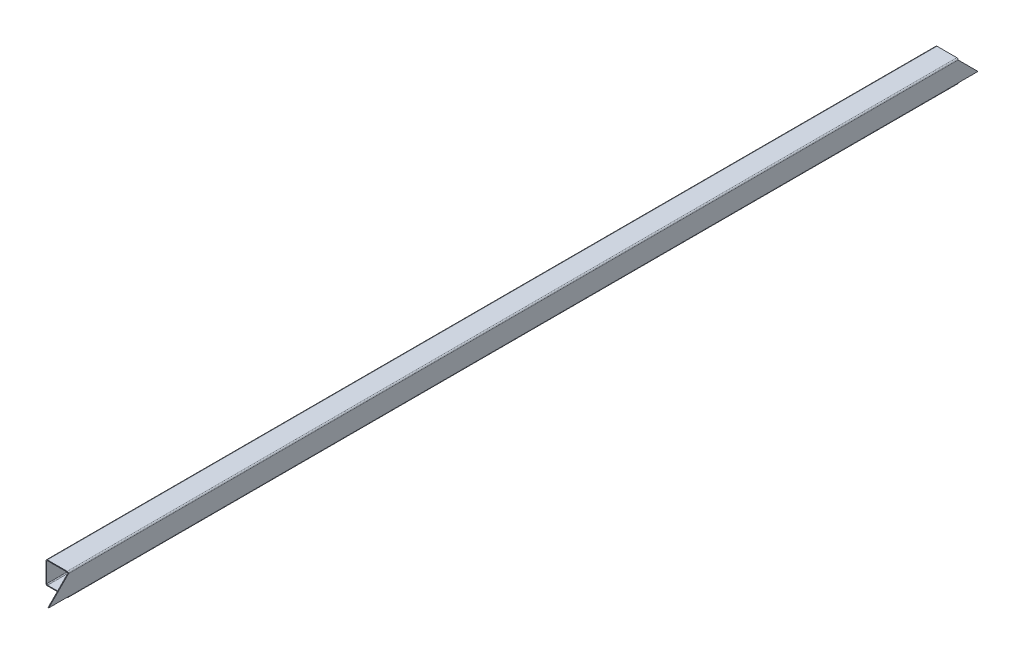
ISO-10303-21;
HEADER;
FILE_DESCRIPTION(('STEP AP214'),'2;1');
FILE_NAME('part.step','',(''),(''),'','','');
FILE_SCHEMA(('AUTOMOTIVE_DESIGN { 1 0 10303 214 1 1 1 1 }'));
ENDSEC;
DATA;
#1=APPLICATION_CONTEXT('core data for automotive mechanical design processes');
#2=APPLICATION_PROTOCOL_DEFINITION('international standard','automotive_design',2000,#1);
#3=PRODUCT_CONTEXT('',#1,'mechanical');
#4=PRODUCT('Part','Part','',(#3));
#5=PRODUCT_RELATED_PRODUCT_CATEGORY('part','',(#4));
#6=PRODUCT_DEFINITION_FORMATION('','',#4);
#7=PRODUCT_DEFINITION_CONTEXT('part definition',#1,'design');
#8=PRODUCT_DEFINITION('design','',#6,#7);
#9=PRODUCT_DEFINITION_SHAPE('','',#8);
#10=(LENGTH_UNIT() NAMED_UNIT(*) SI_UNIT(.MILLI.,.METRE.));
#11=(NAMED_UNIT(*) PLANE_ANGLE_UNIT() SI_UNIT($,.RADIAN.));
#12=(NAMED_UNIT(*) SI_UNIT($,.STERADIAN.) SOLID_ANGLE_UNIT());
#13=UNCERTAINTY_MEASURE_WITH_UNIT(LENGTH_MEASURE(1.E-05),#10,'distance_accuracy_value','');
#14=(GEOMETRIC_REPRESENTATION_CONTEXT(3) GLOBAL_UNCERTAINTY_ASSIGNED_CONTEXT((#13)) GLOBAL_UNIT_ASSIGNED_CONTEXT((#10,
#11,#12)) REPRESENTATION_CONTEXT('',''));
#15=CARTESIAN_POINT('',(0.,0.,0.));
#16=DIRECTION('',(0.,0.,1.));
#17=DIRECTION('',(1.,0.,0.));
#18=AXIS2_PLACEMENT_3D('',#15,#16,#17);
#19=CARTESIAN_POINT('',(-44.0000000000005,-43.9999999999965,-3950.));
#20=DIRECTION('',(0.,0.,1.));
#21=DIRECTION('',(1.,0.,0.));
#22=AXIS2_PLACEMENT_3D('',#19,#20,#21);
#23=PLANE('',#22);
#24=DIRECTION('',(0.,1.,0.));
#25=VECTOR('',#24,1.);
#26=CARTESIAN_POINT('',(46.9999999999991,-43.9999999999965,-3950.));
#27=LINE('',#26,#25);
#28=CARTESIAN_POINT('',(46.9999999999991,-43.9999999999965,-3950.));
#29=VERTEX_POINT('',#28);
#30=CARTESIAN_POINT('',(46.9999999999991,-42.9999999999966,-3950.));
#31=VERTEX_POINT('',#30);
#32=EDGE_CURVE('E46',#29,#31,#27,.T.);
#33=ORIENTED_EDGE('',*,*,#32,.F.);
#34=DIRECTION('',(1.,0.,0.));
#35=VECTOR('',#34,1.);
#36=CARTESIAN_POINT('',(-77.4507934888333,-43.9999999999965,-3950.));
#37=LINE('',#36,#35);
#38=CARTESIAN_POINT('',(49.9999999999989,-43.9999999999965,-3950.));
#39=VERTEX_POINT('',#38);
#40=EDGE_CURVE('E199',#29,#39,#37,.T.);
#41=ORIENTED_EDGE('',*,*,#40,.T.);
#42=CARTESIAN_POINT('',(43.9999999999987,-43.9999999999965,-3950.));
#43=DIRECTION('',(0.,0.,1.));
#44=DIRECTION('',(1.,0.,0.));
#45=AXIS2_PLACEMENT_3D('',#42,#43,#44);
#46=CIRCLE('',#45,6.00000000000014);
#47=CARTESIAN_POINT('',(43.9999999999987,-49.9999999999967,-3950.));
#48=VERTEX_POINT('',#47);
#49=EDGE_CURVE('E290',#48,#39,#46,.T.);
#50=ORIENTED_EDGE('',*,*,#49,.F.);
#51=DIRECTION('',(1.,0.,0.));
#52=VECTOR('',#51,1.);
#53=CARTESIAN_POINT('',(-44.0000000000005,-49.9999999999966,-3950.));
#54=LINE('',#53,#52);
#55=CARTESIAN_POINT('',(-44.0000000000005,-49.9999999999966,-3950.));
#56=VERTEX_POINT('',#55);
#57=EDGE_CURVE('E286',#56,#48,#54,.T.);
#58=ORIENTED_EDGE('',*,*,#57,.F.);
#59=CARTESIAN_POINT('',(-44.0000000000005,-43.9999999999965,-3950.));
#60=DIRECTION('',(0.,0.,1.));
#61=DIRECTION('',(1.,0.,0.));
#62=AXIS2_PLACEMENT_3D('',#59,#60,#61);
#63=CIRCLE('',#62,6.00000000000014);
#64=CARTESIAN_POINT('',(-50.0000000000007,-43.9999999999965,-3950.));
#65=VERTEX_POINT('',#64);
#66=EDGE_CURVE('E283',#65,#56,#63,.T.);
#67=ORIENTED_EDGE('',*,*,#66,.F.);
#68=DIRECTION('',(0.,-1.,0.));
#69=VECTOR('',#68,1.);
#70=CARTESIAN_POINT('',(-50.0000000000007,44.0000000000034,-3950.));
#71=LINE('',#70,#69);
#72=CARTESIAN_POINT('',(-50.0000000000007,44.0000000000034,-3950.));
#73=VERTEX_POINT('',#72);
#74=EDGE_CURVE('E301',#73,#65,#71,.T.);
#75=ORIENTED_EDGE('',*,*,#74,.F.);
#76=CARTESIAN_POINT('',(-44.0000000000005,44.0000000000034,-3950.));
#77=DIRECTION('',(0.,0.,1.));
#78=DIRECTION('',(1.,0.,0.));
#79=AXIS2_PLACEMENT_3D('',#76,#77,#78);
#80=CIRCLE('',#79,6.00000000000014);
#81=CARTESIAN_POINT('',(-44.0000000000005,50.0000000000036,-3950.));
#82=VERTEX_POINT('',#81);
#83=EDGE_CURVE('E298',#82,#73,#80,.T.);
#84=ORIENTED_EDGE('',*,*,#83,.F.);
#85=DIRECTION('',(-1.,0.,0.));
#86=VECTOR('',#85,1.);
#87=CARTESIAN_POINT('',(-44.0000000000005,50.0000000000035,-3950.));
#88=LINE('',#87,#86);
#89=CARTESIAN_POINT('',(43.9999999999987,50.0000000000035,-3950.));
#90=VERTEX_POINT('',#89);
#91=EDGE_CURVE('E295',#90,#82,#88,.T.);
#92=ORIENTED_EDGE('',*,*,#91,.F.);
#93=CARTESIAN_POINT('',(43.9999999999987,44.0000000000034,-3950.));
#94=DIRECTION('',(0.,0.,1.));
#95=DIRECTION('',(-1.,0.,0.));
#96=AXIS2_PLACEMENT_3D('',#93,#94,#95);
#97=CIRCLE('',#96,6.00000000000014);
#98=CARTESIAN_POINT('',(49.9999999999989,44.0000000000034,-3950.));
#99=VERTEX_POINT('',#98);
#100=EDGE_CURVE('E292',#99,#90,#97,.T.);
#101=ORIENTED_EDGE('',*,*,#100,.F.);
#102=DIRECTION('',(1.,0.,0.));
#103=VECTOR('',#102,1.);
#104=CARTESIAN_POINT('',(-77.4507934888333,44.0000000000034,-3950.));
#105=LINE('',#104,#103);
#106=CARTESIAN_POINT('',(46.9999999999991,44.0000000000034,-3950.));
#107=VERTEX_POINT('',#106);
#108=EDGE_CURVE('E59',#107,#99,#105,.T.);
#109=ORIENTED_EDGE('',*,*,#108,.F.);
#110=CARTESIAN_POINT('',(46.9999999999991,43.0000000000035,-3950.));
#111=VERTEX_POINT('',#110);
#112=EDGE_CURVE('E11',#111,#107,#27,.T.);
#113=ORIENTED_EDGE('',*,*,#112,.F.);
#114=CARTESIAN_POINT('',(42.9999999999991,43.0000000000035,-3950.));
#115=DIRECTION('',(0.,0.,1.));
#116=DIRECTION('',(-1.,0.,0.));
#117=AXIS2_PLACEMENT_3D('',#114,#115,#116);
#118=CIRCLE('',#117,4.);
#119=CARTESIAN_POINT('',(42.9999999999991,47.0000000000035,-3950.));
#120=VERTEX_POINT('',#119);
#121=EDGE_CURVE('E234',#111,#120,#118,.T.);
#122=ORIENTED_EDGE('',*,*,#121,.T.);
#123=DIRECTION('',(-1.,0.,0.));
#124=VECTOR('',#123,1.);
#125=CARTESIAN_POINT('',(-43.0000000000009,47.0000000000035,-3950.));
#126=LINE('',#125,#124);
#127=CARTESIAN_POINT('',(-43.0000000000009,47.0000000000035,-3950.));
#128=VERTEX_POINT('',#127);
#129=EDGE_CURVE('E237',#120,#128,#126,.T.);
#130=ORIENTED_EDGE('',*,*,#129,.T.);
#131=CARTESIAN_POINT('',(-43.0000000000009,43.0000000000035,-3950.));
#132=DIRECTION('',(0.,0.,1.));
#133=DIRECTION('',(1.,0.,0.));
#134=AXIS2_PLACEMENT_3D('',#131,#132,#133);
#135=CIRCLE('',#134,4.);
#136=CARTESIAN_POINT('',(-47.0000000000009,43.0000000000035,-3950.));
#137=VERTEX_POINT('',#136);
#138=EDGE_CURVE('E240',#128,#137,#135,.T.);
#139=ORIENTED_EDGE('',*,*,#138,.T.);
#140=DIRECTION('',(0.,-1.,0.));
#141=VECTOR('',#140,1.);
#142=CARTESIAN_POINT('',(-47.0000000000009,43.0000000000035,-3950.));
#143=LINE('',#142,#141);
#144=CARTESIAN_POINT('',(-47.0000000000009,-42.9999999999966,-3950.));
#145=VERTEX_POINT('',#144);
#146=EDGE_CURVE('E243',#137,#145,#143,.T.);
#147=ORIENTED_EDGE('',*,*,#146,.T.);
#148=CARTESIAN_POINT('',(-43.0000000000009,-42.9999999999966,-3950.));
#149=DIRECTION('',(0.,0.,1.));
#150=DIRECTION('',(1.,0.,0.));
#151=AXIS2_PLACEMENT_3D('',#148,#149,#150);
#152=CIRCLE('',#151,4.);
#153=CARTESIAN_POINT('',(-43.0000000000009,-46.9999999999966,-3950.));
#154=VERTEX_POINT('',#153);
#155=EDGE_CURVE('E225',#145,#154,#152,.T.);
#156=ORIENTED_EDGE('',*,*,#155,.T.);
#157=DIRECTION('',(1.,0.,0.));
#158=VECTOR('',#157,1.);
#159=CARTESIAN_POINT('',(-43.0000000000009,-46.9999999999966,-3950.));
#160=LINE('',#159,#158);
#161=CARTESIAN_POINT('',(42.9999999999991,-46.9999999999966,-3950.));
#162=VERTEX_POINT('',#161);
#163=EDGE_CURVE('E228',#154,#162,#160,.T.);
#164=ORIENTED_EDGE('',*,*,#163,.T.);
#165=CARTESIAN_POINT('',(42.9999999999991,-42.9999999999966,-3950.));
#166=DIRECTION('',(0.,0.,1.));
#167=DIRECTION('',(1.,0.,0.));
#168=AXIS2_PLACEMENT_3D('',#165,#166,#167);
#169=CIRCLE('',#168,4.);
#170=EDGE_CURVE('E232',#162,#31,#169,.T.);
#171=ORIENTED_EDGE('',*,*,#170,.T.);
#172=EDGE_LOOP('',(#33,#41,#50,#58,#67,#75,#84,#92,#101,#109,#113,#122,#130,#139,#147,#156,#164,#171));
#173=FACE_BOUND('',#172,.T.);
#174=ADVANCED_FACE('F35',(#173),#23,.F.);
#175=CARTESIAN_POINT('',(-44.0000000000005,-43.9999999999965,-3950.));
#176=DIRECTION('',(0.,0.,1.));
#177=DIRECTION('',(1.,0.,0.));
#178=AXIS2_PLACEMENT_3D('',#175,#176,#177);
#179=CYLINDRICAL_SURFACE('',#178,6.00000000000014);
#180=CARTESIAN_POINT('',(-44.0000000000005,-43.9999999999965,0.));
#181=DIRECTION('',(0.,0.,1.));
#182=DIRECTION('',(1.,0.,0.));
#183=AXIS2_PLACEMENT_3D('',#180,#181,#182);
#184=CIRCLE('',#183,6.00000000000014);
#185=CARTESIAN_POINT('',(-50.0000000000007,-43.9999999999965,0.));
#186=VERTEX_POINT('',#185);
#187=CARTESIAN_POINT('',(-44.0000000000005,-49.9999999999966,0.));
#188=VERTEX_POINT('',#187);
#189=EDGE_CURVE('E267',#186,#188,#184,.T.);
#190=ORIENTED_EDGE('',*,*,#189,.F.);
#191=DIRECTION('',(0.,0.,1.));
#192=VECTOR('',#191,1.);
#193=CARTESIAN_POINT('',(-50.0000000000007,-43.9999999999965,-3950.));
#194=LINE('',#193,#192);
#195=EDGE_CURVE('E322',#65,#186,#194,.T.);
#196=ORIENTED_EDGE('',*,*,#195,.F.);
#197=ORIENTED_EDGE('',*,*,#66,.T.);
#198=DIRECTION('',(0.,0.,1.));
#199=VECTOR('',#198,1.);
#200=CARTESIAN_POINT('',(-44.0000000000005,-49.9999999999966,-3950.));
#201=LINE('',#200,#199);
#202=EDGE_CURVE('E39',#56,#188,#201,.T.);
#203=ORIENTED_EDGE('',*,*,#202,.T.);
#204=EDGE_LOOP('',(#190,#196,#197,#203));
#205=FACE_BOUND('',#204,.T.);
#206=ADVANCED_FACE('F37',(#205),#179,.T.);
#207=CARTESIAN_POINT('',(-50.0000000000007,44.0000000000034,-3950.));
#208=DIRECTION('',(-1.,0.,0.));
#209=DIRECTION('',(0.,0.,1.));
#210=AXIS2_PLACEMENT_3D('',#207,#208,#209);
#211=PLANE('',#210);
#212=DIRECTION('',(0.,-1.,0.));
#213=VECTOR('',#212,1.);
#214=CARTESIAN_POINT('',(-50.0000000000007,44.0000000000034,0.));
#215=LINE('',#214,#213);
#216=CARTESIAN_POINT('',(-50.0000000000007,44.0000000000034,0.));
#217=VERTEX_POINT('',#216);
#218=EDGE_CURVE('E287',#217,#186,#215,.T.);
#219=ORIENTED_EDGE('',*,*,#218,.F.);
#220=DIRECTION('',(0.,0.,1.));
#221=VECTOR('',#220,1.);
#222=CARTESIAN_POINT('',(-50.0000000000007,44.0000000000034,-3950.));
#223=LINE('',#222,#221);
#224=EDGE_CURVE('E324',#73,#217,#223,.T.);
#225=ORIENTED_EDGE('',*,*,#224,.F.);
#226=ORIENTED_EDGE('',*,*,#74,.T.);
#227=ORIENTED_EDGE('',*,*,#195,.T.);
#228=EDGE_LOOP('',(#219,#225,#226,#227));
#229=FACE_BOUND('',#228,.T.);
#230=ADVANCED_FACE('F346',(#229),#211,.T.);
#231=CARTESIAN_POINT('',(-44.0000000000005,44.0000000000034,-3950.));
#232=DIRECTION('',(0.,0.,1.));
#233=DIRECTION('',(1.,0.,0.));
#234=AXIS2_PLACEMENT_3D('',#231,#232,#233);
#235=CYLINDRICAL_SURFACE('',#234,6.00000000000014);
#236=CARTESIAN_POINT('',(-44.0000000000005,44.0000000000034,0.));
#237=DIRECTION('',(0.,0.,1.));
#238=DIRECTION('',(1.,0.,0.));
#239=AXIS2_PLACEMENT_3D('',#236,#237,#238);
#240=CIRCLE('',#239,6.00000000000014);
#241=CARTESIAN_POINT('',(-44.0000000000005,50.0000000000036,0.));
#242=VERTEX_POINT('',#241);
#243=EDGE_CURVE('E317',#242,#217,#240,.T.);
#244=ORIENTED_EDGE('',*,*,#243,.F.);
#245=DIRECTION('',(0.,0.,1.));
#246=VECTOR('',#245,1.);
#247=CARTESIAN_POINT('',(-44.0000000000005,50.0000000000036,-3950.));
#248=LINE('',#247,#246);
#249=EDGE_CURVE('E326',#82,#242,#248,.T.);
#250=ORIENTED_EDGE('',*,*,#249,.F.);
#251=ORIENTED_EDGE('',*,*,#83,.T.);
#252=ORIENTED_EDGE('',*,*,#224,.T.);
#253=EDGE_LOOP('',(#244,#250,#251,#252));
#254=FACE_BOUND('',#253,.T.);
#255=ADVANCED_FACE('F413',(#254),#235,.T.);
#256=CARTESIAN_POINT('',(-44.0000000000005,50.0000000000035,-3950.));
#257=DIRECTION('',(0.,1.,0.));
#258=DIRECTION('',(0.,0.,1.));
#259=AXIS2_PLACEMENT_3D('',#256,#257,#258);
#260=PLANE('',#259);
#261=DIRECTION('',(-1.,0.,0.));
#262=VECTOR('',#261,1.);
#263=CARTESIAN_POINT('',(-44.0000000000005,50.0000000000035,0.));
#264=LINE('',#263,#262);
#265=CARTESIAN_POINT('',(43.9999999999987,50.0000000000035,0.));
#266=VERTEX_POINT('',#265);
#267=EDGE_CURVE('E314',#266,#242,#264,.T.);
#268=ORIENTED_EDGE('',*,*,#267,.F.);
#269=DIRECTION('',(0.,0.,1.));
#270=VECTOR('',#269,1.);
#271=CARTESIAN_POINT('',(43.9999999999987,50.0000000000035,-3950.));
#272=LINE('',#271,#270);
#273=EDGE_CURVE('E328',#90,#266,#272,.T.);
#274=ORIENTED_EDGE('',*,*,#273,.F.);
#275=ORIENTED_EDGE('',*,*,#91,.T.);
#276=ORIENTED_EDGE('',*,*,#249,.T.);
#277=EDGE_LOOP('',(#268,#274,#275,#276));
#278=FACE_BOUND('',#277,.T.);
#279=ADVANCED_FACE('F416',(#278),#260,.T.);
#280=CARTESIAN_POINT('',(43.9999999999987,44.0000000000034,-3950.));
#281=DIRECTION('',(0.,0.,1.));
#282=DIRECTION('',(1.,0.,0.));
#283=AXIS2_PLACEMENT_3D('',#280,#281,#282);
#284=CYLINDRICAL_SURFACE('',#283,6.00000000000014);
#285=CARTESIAN_POINT('',(43.9999999999987,44.0000000000034,0.));
#286=DIRECTION('',(0.,0.,1.));
#287=DIRECTION('',(-1.,0.,0.));
#288=AXIS2_PLACEMENT_3D('',#285,#286,#287);
#289=CIRCLE('',#288,6.00000000000014);
#290=CARTESIAN_POINT('',(49.9999999999988,44.0000000000034,0.));
#291=VERTEX_POINT('',#290);
#292=EDGE_CURVE('E311',#291,#266,#289,.T.);
#293=ORIENTED_EDGE('',*,*,#292,.F.);
#294=DIRECTION('',(0.,0.,1.));
#295=VECTOR('',#294,1.);
#296=CARTESIAN_POINT('',(49.9999999999988,44.0000000000034,-3950.));
#297=LINE('',#296,#295);
#298=EDGE_CURVE('E330',#99,#291,#297,.T.);
#299=ORIENTED_EDGE('',*,*,#298,.F.);
#300=ORIENTED_EDGE('',*,*,#100,.T.);
#301=ORIENTED_EDGE('',*,*,#273,.T.);
#302=EDGE_LOOP('',(#293,#299,#300,#301));
#303=FACE_BOUND('',#302,.T.);
#304=ADVANCED_FACE('F420',(#303),#284,.T.);
#305=CARTESIAN_POINT('',(49.9999999999989,44.0000000000034,-3950.));
#306=DIRECTION('',(1.,0.,0.));
#307=DIRECTION('',(0.,0.,-1.));
#308=AXIS2_PLACEMENT_3D('',#305,#306,#307);
#309=PLANE('',#308);
#310=ORIENTED_EDGE('',*,*,#298,.T.);
#311=DIRECTION('',(0.,-0.707106781186548,0.707106781186547));
#312=VECTOR('',#311,1.);
#313=CARTESIAN_POINT('',(49.9999999999989,-43.9999999999966,88.));
#314=LINE('',#313,#312);
#315=CARTESIAN_POINT('',(49.9999999999989,-43.9999999999966,88.));
#316=VERTEX_POINT('',#315);
#317=EDGE_CURVE('E213',#291,#316,#314,.T.);
#318=ORIENTED_EDGE('',*,*,#317,.T.);
#319=DIRECTION('',(0.,0.,-1.));
#320=VECTOR('',#319,1.);
#321=CARTESIAN_POINT('',(49.9999999999989,-43.9999999999965,0.));
#322=LINE('',#321,#320);
#323=CARTESIAN_POINT('',(49.9999999999989,-43.9999999999965,0.));
#324=VERTEX_POINT('',#323);
#325=EDGE_CURVE('E204',#316,#324,#322,.T.);
#326=ORIENTED_EDGE('',*,*,#325,.T.);
#327=DIRECTION('',(0.,0.,1.));
#328=VECTOR('',#327,1.);
#329=CARTESIAN_POINT('',(49.9999999999989,-43.9999999999965,-3950.));
#330=LINE('',#329,#328);
#331=EDGE_CURVE('E194',#39,#324,#330,.T.);
#332=ORIENTED_EDGE('',*,*,#331,.F.);
#333=DIRECTION('',(0.,0.,-1.));
#334=VECTOR('',#333,1.);
#335=CARTESIAN_POINT('',(49.9999999999989,-43.9999999999965,-3950.));
#336=LINE('',#335,#334);
#337=CARTESIAN_POINT('',(49.9999999999989,-43.9999999999965,-4038.));
#338=VERTEX_POINT('',#337);
#339=EDGE_CURVE('E179',#39,#338,#336,.T.);
#340=ORIENTED_EDGE('',*,*,#339,.T.);
#341=DIRECTION('',(0.,0.707106781186547,0.707106781186548));
#342=VECTOR('',#341,1.);
#343=CARTESIAN_POINT('',(49.9999999999989,-43.9999999999965,-4038.));
#344=LINE('',#343,#342);
#345=EDGE_CURVE('E183',#338,#99,#344,.T.);
#346=ORIENTED_EDGE('',*,*,#345,.T.);
#347=EDGE_LOOP('',(#310,#318,#326,#332,#340,#346));
#348=FACE_BOUND('',#347,.T.);
#349=ADVANCED_FACE('F191',(#348),#309,.T.);
#350=CARTESIAN_POINT('',(43.9999999999987,-43.9999999999965,-3950.));
#351=DIRECTION('',(0.,0.,1.));
#352=DIRECTION('',(1.,0.,0.));
#353=AXIS2_PLACEMENT_3D('',#350,#351,#352);
#354=CYLINDRICAL_SURFACE('',#353,6.00000000000014);
#355=CARTESIAN_POINT('',(43.9999999999987,-43.9999999999965,0.));
#356=DIRECTION('',(0.,0.,1.));
#357=DIRECTION('',(1.,0.,0.));
#358=AXIS2_PLACEMENT_3D('',#355,#356,#357);
#359=CIRCLE('',#358,6.00000000000014);
#360=CARTESIAN_POINT('',(43.9999999999987,-49.9999999999967,0.));
#361=VERTEX_POINT('',#360);
#362=EDGE_CURVE('E309',#361,#324,#359,.T.);
#363=ORIENTED_EDGE('',*,*,#362,.F.);
#364=DIRECTION('',(0.,0.,1.));
#365=VECTOR('',#364,1.);
#366=CARTESIAN_POINT('',(43.9999999999987,-49.9999999999967,-3950.));
#367=LINE('',#366,#365);
#368=EDGE_CURVE('E332',#48,#361,#367,.T.);
#369=ORIENTED_EDGE('',*,*,#368,.F.);
#370=ORIENTED_EDGE('',*,*,#49,.T.);
#371=ORIENTED_EDGE('',*,*,#331,.T.);
#372=EDGE_LOOP('',(#363,#369,#370,#371));
#373=FACE_BOUND('',#372,.T.);
#374=ADVANCED_FACE('F351',(#373),#354,.T.);
#375=CARTESIAN_POINT('',(-44.0000000000005,-49.9999999999966,-3950.));
#376=DIRECTION('',(0.,-1.,0.));
#377=DIRECTION('',(0.,0.,-1.));
#378=AXIS2_PLACEMENT_3D('',#375,#376,#377);
#379=PLANE('',#378);
#380=DIRECTION('',(1.,0.,0.));
#381=VECTOR('',#380,1.);
#382=CARTESIAN_POINT('',(-44.0000000000005,-49.9999999999966,0.));
#383=LINE('',#382,#381);
#384=EDGE_CURVE('E306',#188,#361,#383,.T.);
#385=ORIENTED_EDGE('',*,*,#384,.F.);
#386=ORIENTED_EDGE('',*,*,#202,.F.);
#387=ORIENTED_EDGE('',*,*,#57,.T.);
#388=ORIENTED_EDGE('',*,*,#368,.T.);
#389=EDGE_LOOP('',(#385,#386,#387,#388));
#390=FACE_BOUND('',#389,.T.);
#391=ADVANCED_FACE('F340',(#390),#379,.T.);
#392=CARTESIAN_POINT('',(-44.0000000000005,-43.9999999999965,0.));
#393=DIRECTION('',(0.,0.,1.));
#394=DIRECTION('',(1.,0.,0.));
#395=AXIS2_PLACEMENT_3D('',#392,#393,#394);
#396=PLANE('',#395);
#397=DIRECTION('',(0.,-1.,0.));
#398=VECTOR('',#397,1.);
#399=CARTESIAN_POINT('',(46.9999999999991,-43.9999999999965,0.));
#400=LINE('',#399,#398);
#401=CARTESIAN_POINT('',(46.9999999999991,44.0000000000034,0.));
#402=VERTEX_POINT('',#401);
#403=CARTESIAN_POINT('',(46.9999999999991,43.0000000000035,0.));
#404=VERTEX_POINT('',#403);
#405=EDGE_CURVE('E211',#402,#404,#400,.T.);
#406=ORIENTED_EDGE('',*,*,#405,.F.);
#407=DIRECTION('',(1.,0.,0.));
#408=VECTOR('',#407,1.);
#409=CARTESIAN_POINT('',(-77.4507934888333,44.0000000000034,0.));
#410=LINE('',#409,#408);
#411=EDGE_CURVE('E218',#402,#291,#410,.T.);
#412=ORIENTED_EDGE('',*,*,#411,.T.);
#413=ORIENTED_EDGE('',*,*,#292,.T.);
#414=ORIENTED_EDGE('',*,*,#267,.T.);
#415=ORIENTED_EDGE('',*,*,#243,.T.);
#416=ORIENTED_EDGE('',*,*,#218,.T.);
#417=ORIENTED_EDGE('',*,*,#189,.T.);
#418=ORIENTED_EDGE('',*,*,#384,.T.);
#419=ORIENTED_EDGE('',*,*,#362,.T.);
#420=DIRECTION('',(1.,0.,0.));
#421=VECTOR('',#420,1.);
#422=CARTESIAN_POINT('',(-77.4507934888333,-43.9999999999965,0.));
#423=LINE('',#422,#421);
#424=CARTESIAN_POINT('',(46.9999999999991,-43.9999999999965,0.));
#425=VERTEX_POINT('',#424);
#426=EDGE_CURVE('E216',#425,#324,#423,.T.);
#427=ORIENTED_EDGE('',*,*,#426,.F.);
#428=CARTESIAN_POINT('',(46.9999999999991,-42.9999999999966,0.));
#429=VERTEX_POINT('',#428);
#430=EDGE_CURVE('E44',#429,#425,#400,.T.);
#431=ORIENTED_EDGE('',*,*,#430,.F.);
#432=CARTESIAN_POINT('',(42.9999999999991,-42.9999999999966,0.));
#433=DIRECTION('',(0.,0.,1.));
#434=DIRECTION('',(1.,0.,0.));
#435=AXIS2_PLACEMENT_3D('',#432,#433,#434);
#436=CIRCLE('',#435,4.);
#437=CARTESIAN_POINT('',(42.9999999999991,-46.9999999999966,0.));
#438=VERTEX_POINT('',#437);
#439=EDGE_CURVE('E251',#438,#429,#436,.T.);
#440=ORIENTED_EDGE('',*,*,#439,.F.);
#441=DIRECTION('',(1.,0.,0.));
#442=VECTOR('',#441,1.);
#443=CARTESIAN_POINT('',(-43.0000000000009,-46.9999999999966,0.));
#444=LINE('',#443,#442);
#445=CARTESIAN_POINT('',(-43.0000000000009,-46.9999999999966,0.));
#446=VERTEX_POINT('',#445);
#447=EDGE_CURVE('E248',#446,#438,#444,.T.);
#448=ORIENTED_EDGE('',*,*,#447,.F.);
#449=CARTESIAN_POINT('',(-43.0000000000009,-42.9999999999966,0.));
#450=DIRECTION('',(0.,0.,1.));
#451=DIRECTION('',(1.,0.,0.));
#452=AXIS2_PLACEMENT_3D('',#449,#450,#451);
#453=CIRCLE('',#452,4.);
#454=CARTESIAN_POINT('',(-47.0000000000009,-42.9999999999966,0.));
#455=VERTEX_POINT('',#454);
#456=EDGE_CURVE('E224',#455,#446,#453,.T.);
#457=ORIENTED_EDGE('',*,*,#456,.F.);
#458=DIRECTION('',(0.,-1.,0.));
#459=VECTOR('',#458,1.);
#460=CARTESIAN_POINT('',(-47.0000000000009,43.0000000000035,0.));
#461=LINE('',#460,#459);
#462=CARTESIAN_POINT('',(-47.0000000000009,43.0000000000035,0.));
#463=VERTEX_POINT('',#462);
#464=EDGE_CURVE('E229',#463,#455,#461,.T.);
#465=ORIENTED_EDGE('',*,*,#464,.F.);
#466=CARTESIAN_POINT('',(-43.0000000000009,43.0000000000035,0.));
#467=DIRECTION('',(0.,0.,1.));
#468=DIRECTION('',(1.,0.,0.));
#469=AXIS2_PLACEMENT_3D('',#466,#467,#468);
#470=CIRCLE('',#469,4.);
#471=CARTESIAN_POINT('',(-43.0000000000009,47.0000000000035,0.));
#472=VERTEX_POINT('',#471);
#473=EDGE_CURVE('E260',#472,#463,#470,.T.);
#474=ORIENTED_EDGE('',*,*,#473,.F.);
#475=DIRECTION('',(-1.,0.,0.));
#476=VECTOR('',#475,1.);
#477=CARTESIAN_POINT('',(-43.0000000000009,47.0000000000035,0.));
#478=LINE('',#477,#476);
#479=CARTESIAN_POINT('',(42.9999999999991,47.0000000000035,0.));
#480=VERTEX_POINT('',#479);
#481=EDGE_CURVE('E257',#480,#472,#478,.T.);
#482=ORIENTED_EDGE('',*,*,#481,.F.);
#483=CARTESIAN_POINT('',(42.9999999999991,43.0000000000035,0.));
#484=DIRECTION('',(0.,0.,1.));
#485=DIRECTION('',(-1.,0.,0.));
#486=AXIS2_PLACEMENT_3D('',#483,#484,#485);
#487=CIRCLE('',#486,4.);
#488=EDGE_CURVE('E254',#404,#480,#487,.T.);
#489=ORIENTED_EDGE('',*,*,#488,.F.);
#490=EDGE_LOOP('',(#406,#412,#413,#414,#415,#416,#417,#418,#419,#427,#431,#440,#448,#457,#465,
#474,#482,#489));
#491=FACE_BOUND('',#490,.T.);
#492=ADVANCED_FACE('F342',(#491),#396,.T.);
#493=CARTESIAN_POINT('',(-43.0000000000009,-42.9999999999966,-3950.));
#494=DIRECTION('',(0.,0.,1.));
#495=DIRECTION('',(1.,0.,0.));
#496=AXIS2_PLACEMENT_3D('',#493,#494,#495);
#497=CYLINDRICAL_SURFACE('',#496,4.);
#498=ORIENTED_EDGE('',*,*,#456,.T.);
#499=DIRECTION('',(0.,0.,1.));
#500=VECTOR('',#499,1.);
#501=CARTESIAN_POINT('',(-43.0000000000009,-46.9999999999966,-3950.));
#502=LINE('',#501,#500);
#503=EDGE_CURVE('E246',#154,#446,#502,.T.);
#504=ORIENTED_EDGE('',*,*,#503,.F.);
#505=ORIENTED_EDGE('',*,*,#155,.F.);
#506=DIRECTION('',(0.,0.,1.));
#507=VECTOR('',#506,1.);
#508=CARTESIAN_POINT('',(-47.0000000000009,-42.9999999999966,-3950.));
#509=LINE('',#508,#507);
#510=EDGE_CURVE('E265',#145,#455,#509,.T.);
#511=ORIENTED_EDGE('',*,*,#510,.T.);
#512=EDGE_LOOP('',(#498,#504,#505,#511));
#513=FACE_BOUND('',#512,.T.);
#514=ADVANCED_FACE('F386',(#513),#497,.F.);
#515=CARTESIAN_POINT('',(-47.0000000000009,43.0000000000035,-3950.));
#516=DIRECTION('',(-1.,0.,0.));
#517=DIRECTION('',(0.,0.,1.));
#518=AXIS2_PLACEMENT_3D('',#515,#516,#517);
#519=PLANE('',#518);
#520=ORIENTED_EDGE('',*,*,#464,.T.);
#521=ORIENTED_EDGE('',*,*,#510,.F.);
#522=ORIENTED_EDGE('',*,*,#146,.F.);
#523=DIRECTION('',(0.,0.,1.));
#524=VECTOR('',#523,1.);
#525=CARTESIAN_POINT('',(-47.0000000000009,43.0000000000035,-3950.));
#526=LINE('',#525,#524);
#527=EDGE_CURVE('E268',#137,#463,#526,.T.);
#528=ORIENTED_EDGE('',*,*,#527,.T.);
#529=EDGE_LOOP('',(#520,#521,#522,#528));
#530=FACE_BOUND('',#529,.T.);
#531=ADVANCED_FACE('F382',(#530),#519,.F.);
#532=CARTESIAN_POINT('',(-43.0000000000009,43.0000000000035,-3950.));
#533=DIRECTION('',(0.,0.,1.));
#534=DIRECTION('',(1.,0.,0.));
#535=AXIS2_PLACEMENT_3D('',#532,#533,#534);
#536=CYLINDRICAL_SURFACE('',#535,4.);
#537=ORIENTED_EDGE('',*,*,#473,.T.);
#538=ORIENTED_EDGE('',*,*,#527,.F.);
#539=ORIENTED_EDGE('',*,*,#138,.F.);
#540=DIRECTION('',(0.,0.,1.));
#541=VECTOR('',#540,1.);
#542=CARTESIAN_POINT('',(-43.0000000000009,47.0000000000035,-3950.));
#543=LINE('',#542,#541);
#544=EDGE_CURVE('E270',#128,#472,#543,.T.);
#545=ORIENTED_EDGE('',*,*,#544,.T.);
#546=EDGE_LOOP('',(#537,#538,#539,#545));
#547=FACE_BOUND('',#546,.T.);
#548=ADVANCED_FACE('F378',(#547),#536,.F.);
#549=CARTESIAN_POINT('',(-43.0000000000009,47.0000000000035,-3950.));
#550=DIRECTION('',(0.,1.,0.));
#551=DIRECTION('',(0.,0.,1.));
#552=AXIS2_PLACEMENT_3D('',#549,#550,#551);
#553=PLANE('',#552);
#554=ORIENTED_EDGE('',*,*,#481,.T.);
#555=ORIENTED_EDGE('',*,*,#544,.F.);
#556=ORIENTED_EDGE('',*,*,#129,.F.);
#557=DIRECTION('',(0.,0.,1.));
#558=VECTOR('',#557,1.);
#559=CARTESIAN_POINT('',(42.9999999999991,47.0000000000035,-3950.));
#560=LINE('',#559,#558);
#561=EDGE_CURVE('E272',#120,#480,#560,.T.);
#562=ORIENTED_EDGE('',*,*,#561,.T.);
#563=EDGE_LOOP('',(#554,#555,#556,#562));
#564=FACE_BOUND('',#563,.T.);
#565=ADVANCED_FACE('F376',(#564),#553,.F.);
#566=CARTESIAN_POINT('',(42.9999999999991,43.0000000000035,-3950.));
#567=DIRECTION('',(0.,0.,1.));
#568=DIRECTION('',(1.,0.,0.));
#569=AXIS2_PLACEMENT_3D('',#566,#567,#568);
#570=CYLINDRICAL_SURFACE('',#569,4.);
#571=ORIENTED_EDGE('',*,*,#488,.T.);
#572=ORIENTED_EDGE('',*,*,#561,.F.);
#573=ORIENTED_EDGE('',*,*,#121,.F.);
#574=DIRECTION('',(0.,0.,1.));
#575=VECTOR('',#574,1.);
#576=CARTESIAN_POINT('',(46.9999999999991,43.0000000000035,-3950.));
#577=LINE('',#576,#575);
#578=EDGE_CURVE('E274',#111,#404,#577,.T.);
#579=ORIENTED_EDGE('',*,*,#578,.T.);
#580=EDGE_LOOP('',(#571,#572,#573,#579));
#581=FACE_BOUND('',#580,.T.);
#582=ADVANCED_FACE('F372',(#581),#570,.F.);
#583=CARTESIAN_POINT('',(46.9999999999991,43.0000000000035,-3950.));
#584=DIRECTION('',(1.,0.,0.));
#585=DIRECTION('',(0.,0.,-1.));
#586=AXIS2_PLACEMENT_3D('',#583,#584,#585);
#587=PLANE('',#586);
#588=DIRECTION('',(0.,0.,1.));
#589=VECTOR('',#588,1.);
#590=CARTESIAN_POINT('',(46.9999999999991,-42.9999999999966,-3950.));
#591=LINE('',#590,#589);
#592=EDGE_CURVE('E276',#31,#429,#591,.T.);
#593=ORIENTED_EDGE('',*,*,#592,.T.);
#594=ORIENTED_EDGE('',*,*,#430,.T.);
#595=DIRECTION('',(0.,0.,1.));
#596=VECTOR('',#595,1.);
#597=CARTESIAN_POINT('',(46.9999999999991,-43.9999999999965,0.));
#598=LINE('',#597,#596);
#599=CARTESIAN_POINT('',(46.9999999999991,-43.9999999999966,88.));
#600=VERTEX_POINT('',#599);
#601=EDGE_CURVE('E208',#425,#600,#598,.T.);
#602=ORIENTED_EDGE('',*,*,#601,.T.);
#603=DIRECTION('',(0.,0.707106781186548,-0.707106781186547));
#604=VECTOR('',#603,1.);
#605=CARTESIAN_POINT('',(46.9999999999991,-43.9999999999966,88.));
#606=LINE('',#605,#604);
#607=EDGE_CURVE('E205',#600,#402,#606,.T.);
#608=ORIENTED_EDGE('',*,*,#607,.T.);
#609=ORIENTED_EDGE('',*,*,#405,.T.);
#610=ORIENTED_EDGE('',*,*,#578,.F.);
#611=ORIENTED_EDGE('',*,*,#112,.T.);
#612=DIRECTION('',(0.,-0.707106781186547,-0.707106781186548));
#613=VECTOR('',#612,1.);
#614=CARTESIAN_POINT('',(46.9999999999991,-43.9999999999965,-4038.));
#615=LINE('',#614,#613);
#616=CARTESIAN_POINT('',(46.9999999999991,-43.9999999999962,-4038.));
#617=VERTEX_POINT('',#616);
#618=EDGE_CURVE('E202',#107,#617,#615,.T.);
#619=ORIENTED_EDGE('',*,*,#618,.T.);
#620=DIRECTION('',(0.,0.,1.));
#621=VECTOR('',#620,1.);
#622=CARTESIAN_POINT('',(46.9999999999991,-43.9999999999965,-3950.));
#623=LINE('',#622,#621);
#624=EDGE_CURVE('E180',#617,#29,#623,.T.);
#625=ORIENTED_EDGE('',*,*,#624,.T.);
#626=ORIENTED_EDGE('',*,*,#32,.T.);
#627=EDGE_LOOP('',(#593,#594,#602,#608,#609,#610,#611,#619,#625,#626));
#628=FACE_BOUND('',#627,.T.);
#629=ADVANCED_FACE('F358',(#628),#587,.F.);
#630=CARTESIAN_POINT('',(42.9999999999991,-42.9999999999966,-3950.));
#631=DIRECTION('',(0.,0.,1.));
#632=DIRECTION('',(1.,0.,0.));
#633=AXIS2_PLACEMENT_3D('',#630,#631,#632);
#634=CYLINDRICAL_SURFACE('',#633,4.);
#635=ORIENTED_EDGE('',*,*,#439,.T.);
#636=ORIENTED_EDGE('',*,*,#592,.F.);
#637=ORIENTED_EDGE('',*,*,#170,.F.);
#638=DIRECTION('',(0.,0.,1.));
#639=VECTOR('',#638,1.);
#640=CARTESIAN_POINT('',(42.9999999999991,-46.9999999999966,-3950.));
#641=LINE('',#640,#639);
#642=EDGE_CURVE('E279',#162,#438,#641,.T.);
#643=ORIENTED_EDGE('',*,*,#642,.T.);
#644=EDGE_LOOP('',(#635,#636,#637,#643));
#645=FACE_BOUND('',#644,.T.);
#646=ADVANCED_FACE('F393',(#645),#634,.F.);
#647=CARTESIAN_POINT('',(-43.0000000000009,-46.9999999999966,-3950.));
#648=DIRECTION('',(0.,-1.,0.));
#649=DIRECTION('',(0.,0.,-1.));
#650=AXIS2_PLACEMENT_3D('',#647,#648,#649);
#651=PLANE('',#650);
#652=ORIENTED_EDGE('',*,*,#447,.T.);
#653=ORIENTED_EDGE('',*,*,#642,.F.);
#654=ORIENTED_EDGE('',*,*,#163,.F.);
#655=ORIENTED_EDGE('',*,*,#503,.T.);
#656=EDGE_LOOP('',(#652,#653,#654,#655));
#657=FACE_BOUND('',#656,.T.);
#658=ADVANCED_FACE('F391',(#657),#651,.F.);
#659=CARTESIAN_POINT('',(-77.4507934888333,-43.9999999999965,0.));
#660=DIRECTION('',(0.,-1.,0.));
#661=DIRECTION('',(0.,0.,-1.));
#662=AXIS2_PLACEMENT_3D('',#659,#660,#661);
#663=PLANE('',#662);
#664=ORIENTED_EDGE('',*,*,#601,.F.);
#665=ORIENTED_EDGE('',*,*,#426,.T.);
#666=ORIENTED_EDGE('',*,*,#325,.F.);
#667=DIRECTION('',(1.,0.,0.));
#668=VECTOR('',#667,1.);
#669=CARTESIAN_POINT('',(-77.4507934888333,-43.9999999999966,88.));
#670=LINE('',#669,#668);
#671=EDGE_CURVE('E209',#600,#316,#670,.T.);
#672=ORIENTED_EDGE('',*,*,#671,.F.);
#673=EDGE_LOOP('',(#664,#665,#666,#672));
#674=FACE_BOUND('',#673,.T.);
#675=ADVANCED_FACE('F361',(#674),#663,.T.);
#676=CARTESIAN_POINT('',(-77.4507934888333,-43.9999999999966,88.));
#677=DIRECTION('',(0.,0.707106781186547,0.707106781186548));
#678=DIRECTION('',(0.,-0.707106781186548,0.707106781186547));
#679=AXIS2_PLACEMENT_3D('',#676,#677,#678);
#680=PLANE('',#679);
#681=ORIENTED_EDGE('',*,*,#607,.F.);
#682=ORIENTED_EDGE('',*,*,#671,.T.);
#683=ORIENTED_EDGE('',*,*,#317,.F.);
#684=ORIENTED_EDGE('',*,*,#411,.F.);
#685=EDGE_LOOP('',(#681,#682,#683,#684));
#686=FACE_BOUND('',#685,.T.);
#687=ADVANCED_FACE('F364',(#686),#680,.T.);
#688=CARTESIAN_POINT('',(-77.4507934888333,-43.9999999999965,-3950.));
#689=DIRECTION('',(0.,-1.,0.));
#690=DIRECTION('',(0.,0.,-1.));
#691=AXIS2_PLACEMENT_3D('',#688,#689,#690);
#692=PLANE('',#691);
#693=ORIENTED_EDGE('',*,*,#624,.F.);
#694=DIRECTION('',(1.,0.,0.));
#695=VECTOR('',#694,1.);
#696=CARTESIAN_POINT('',(-77.4507934888333,-43.9999999999965,-4038.));
#697=LINE('',#696,#695);
#698=EDGE_CURVE('E174',#617,#338,#697,.T.);
#699=ORIENTED_EDGE('',*,*,#698,.T.);
#700=ORIENTED_EDGE('',*,*,#339,.F.);
#701=ORIENTED_EDGE('',*,*,#40,.F.);
#702=EDGE_LOOP('',(#693,#699,#700,#701));
#703=FACE_BOUND('',#702,.T.);
#704=ADVANCED_FACE('F176',(#703),#692,.T.);
#705=CARTESIAN_POINT('',(-77.4507934888333,-43.9999999999965,-4038.));
#706=DIRECTION('',(0.,0.707106781186548,-0.707106781186547));
#707=DIRECTION('',(0.,0.707106781186547,0.707106781186548));
#708=AXIS2_PLACEMENT_3D('',#705,#706,#707);
#709=PLANE('',#708);
#710=ORIENTED_EDGE('',*,*,#618,.F.);
#711=ORIENTED_EDGE('',*,*,#108,.T.);
#712=ORIENTED_EDGE('',*,*,#345,.F.);
#713=ORIENTED_EDGE('',*,*,#698,.F.);
#714=EDGE_LOOP('',(#710,#711,#712,#713));
#715=FACE_BOUND('',#714,.T.);
#716=ADVANCED_FACE('F186',(#715),#709,.T.);
#717=CLOSED_SHELL('',(#174,#206,#230,#255,#279,#304,#349,#374,#391,#492,#514,#531,#548,#565,
#582,#629,#646,#658,#675,#687,#704,#716));
#718=MANIFOLD_SOLID_BREP('B2',#717);
#719=ADVANCED_BREP_SHAPE_REPRESENTATION('',(#18,#718),#14);
#720=SHAPE_DEFINITION_REPRESENTATION(#9,#719);
ENDSEC;
END-ISO-10303-21;
